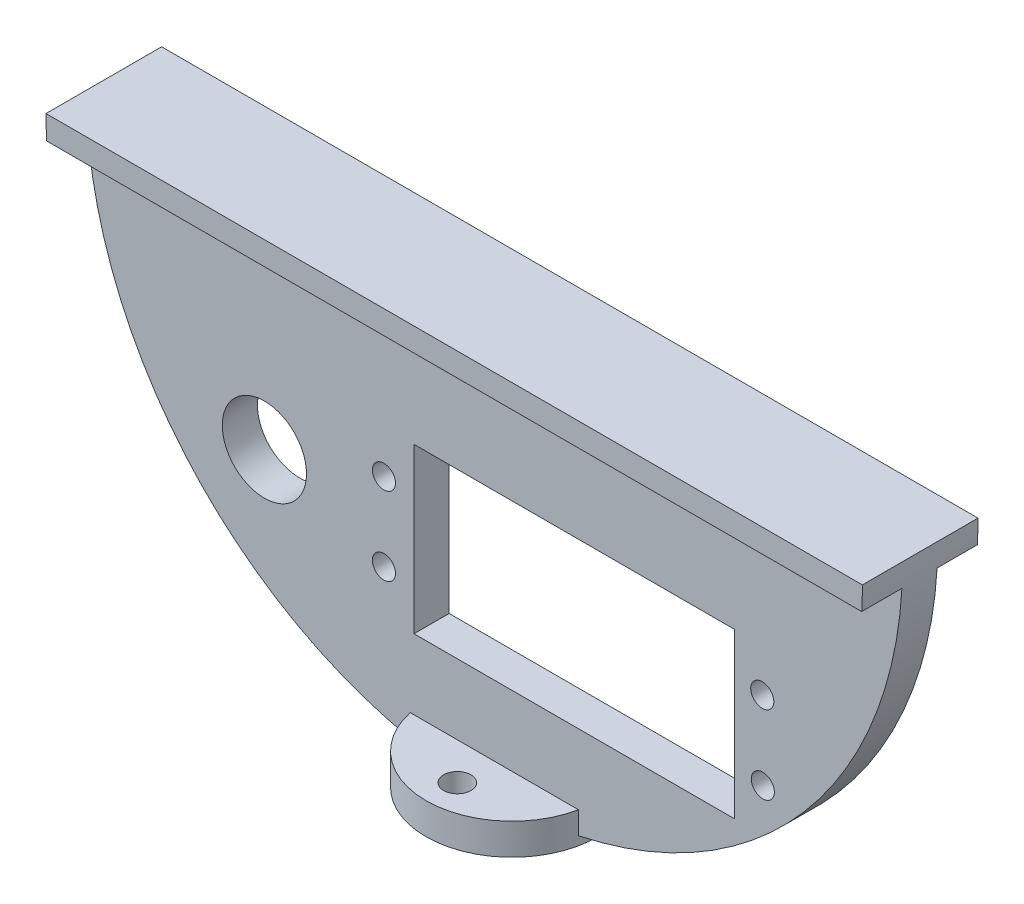
ISO-10303-21;
HEADER;
FILE_DESCRIPTION(('STEP AP214'),'2;1');
FILE_NAME('part.step','',(''),(''),'','','');
FILE_SCHEMA(('AUTOMOTIVE_DESIGN { 1 0 10303 214 1 1 1 1 }'));
ENDSEC;
DATA;
#1=APPLICATION_CONTEXT('core data for automotive mechanical design processes');
#2=APPLICATION_PROTOCOL_DEFINITION('international standard','automotive_design',2000,#1);
#3=PRODUCT_CONTEXT('',#1,'mechanical');
#4=PRODUCT('Part','Part','',(#3));
#5=PRODUCT_RELATED_PRODUCT_CATEGORY('part','',(#4));
#6=PRODUCT_DEFINITION_FORMATION('','',#4);
#7=PRODUCT_DEFINITION_CONTEXT('part definition',#1,'design');
#8=PRODUCT_DEFINITION('design','',#6,#7);
#9=PRODUCT_DEFINITION_SHAPE('','',#8);
#10=(LENGTH_UNIT() NAMED_UNIT(*) SI_UNIT(.MILLI.,.METRE.));
#11=(NAMED_UNIT(*) PLANE_ANGLE_UNIT() SI_UNIT($,.RADIAN.));
#12=(NAMED_UNIT(*) SI_UNIT($,.STERADIAN.) SOLID_ANGLE_UNIT());
#13=UNCERTAINTY_MEASURE_WITH_UNIT(LENGTH_MEASURE(1.E-05),#10,'distance_accuracy_value','');
#14=(GEOMETRIC_REPRESENTATION_CONTEXT(3) GLOBAL_UNCERTAINTY_ASSIGNED_CONTEXT((#13)) GLOBAL_UNIT_ASSIGNED_CONTEXT((#10,
#11,#12)) REPRESENTATION_CONTEXT('',''));
#15=CARTESIAN_POINT('',(0.,0.,0.));
#16=DIRECTION('',(0.,0.,1.));
#17=DIRECTION('',(1.,0.,0.));
#18=AXIS2_PLACEMENT_3D('',#15,#16,#17);
#19=CARTESIAN_POINT('',(0.,0.,4.5));
#20=DIRECTION('',(0.,0.,1.));
#21=DIRECTION('',(1.,0.,0.));
#22=AXIS2_PLACEMENT_3D('',#19,#20,#21);
#23=PLANE('',#22);
#24=CARTESIAN_POINT('',(-29.4453940508057,-28.4254214102192,4.5));
#25=DIRECTION('',(0.,0.,1.));
#26=DIRECTION('',(1.,0.,0.));
#27=AXIS2_PLACEMENT_3D('',#24,#25,#26);
#28=CIRCLE('',#27,5.39005967208397);
#29=CARTESIAN_POINT('',(-24.0553343787218,-28.4254214102192,4.5));
#30=VERTEX_POINT('',#29);
#31=EDGE_CURVE('E500',#30,#30,#28,.T.);
#32=ORIENTED_EDGE('',*,*,#31,.F.);
#33=EDGE_LOOP('',(#32));
#34=FACE_BOUND('',#33,.T.);
#35=CARTESIAN_POINT('',(34.3560560625091,-33.7668022095369,4.5));
#36=DIRECTION('',(0.,0.,1.));
#37=DIRECTION('',(1.,0.,0.));
#38=AXIS2_PLACEMENT_3D('',#35,#36,#37);
#39=CIRCLE('',#38,1.47802183440209);
#40=CARTESIAN_POINT('',(35.8340778969111,-33.7668022095369,4.5));
#41=VERTEX_POINT('',#40);
#42=EDGE_CURVE('E503',#41,#41,#39,.T.);
#43=ORIENTED_EDGE('',*,*,#42,.F.);
#44=EDGE_LOOP('',(#43));
#45=FACE_BOUND('',#44,.T.);
#46=CARTESIAN_POINT('',(-14.1439439374909,-33.7668022095369,4.5));
#47=DIRECTION('',(0.,0.,1.));
#48=DIRECTION('',(1.,0.,0.));
#49=AXIS2_PLACEMENT_3D('',#46,#47,#48);
#50=CIRCLE('',#49,1.47802183440209);
#51=CARTESIAN_POINT('',(-12.6659221030888,-33.7668022095369,4.5));
#52=VERTEX_POINT('',#51);
#53=EDGE_CURVE('E505',#52,#52,#50,.T.);
#54=ORIENTED_EDGE('',*,*,#53,.F.);
#55=EDGE_LOOP('',(#54));
#56=FACE_BOUND('',#55,.T.);
#57=CARTESIAN_POINT('',(34.2860560625091,-23.7668022095369,4.5));
#58=DIRECTION('',(0.,0.,1.));
#59=DIRECTION('',(1.,0.,0.));
#60=AXIS2_PLACEMENT_3D('',#57,#58,#59);
#61=CIRCLE('',#60,1.47802183440209);
#62=CARTESIAN_POINT('',(35.7640778969112,-23.7668022095369,4.5));
#63=VERTEX_POINT('',#62);
#64=EDGE_CURVE('E512',#63,#63,#61,.T.);
#65=ORIENTED_EDGE('',*,*,#64,.F.);
#66=EDGE_LOOP('',(#65));
#67=FACE_BOUND('',#66,.T.);
#68=CARTESIAN_POINT('',(-14.1439439374909,-23.7668022095369,4.5));
#69=DIRECTION('',(0.,0.,1.));
#70=DIRECTION('',(1.,0.,0.));
#71=AXIS2_PLACEMENT_3D('',#68,#69,#70);
#72=CIRCLE('',#71,1.47802183440209);
#73=CARTESIAN_POINT('',(-12.6659221030889,-23.7668022095369,4.5));
#74=VERTEX_POINT('',#73);
#75=EDGE_CURVE('E509',#74,#74,#72,.T.);
#76=ORIENTED_EDGE('',*,*,#75,.F.);
#77=EDGE_LOOP('',(#76));
#78=FACE_BOUND('',#77,.T.);
#79=DIRECTION('',(0.,-1.,0.));
#80=VECTOR('',#79,1.);
#81=CARTESIAN_POINT('',(-10.2939439374909,-18.2668022095369,4.5));
#82=LINE('',#81,#80);
#83=CARTESIAN_POINT('',(-10.2939439374909,-18.2668022095369,4.5));
#84=VERTEX_POINT('',#83);
#85=CARTESIAN_POINT('',(-10.2939439374909,-39.2668022095369,4.5));
#86=VERTEX_POINT('',#85);
#87=EDGE_CURVE('E61',#84,#86,#82,.T.);
#88=ORIENTED_EDGE('',*,*,#87,.F.);
#89=DIRECTION('',(-1.,0.,0.));
#90=VECTOR('',#89,1.);
#91=CARTESIAN_POINT('',(-10.2939439374909,-18.2668022095369,4.5));
#92=LINE('',#91,#90);
#93=CARTESIAN_POINT('',(30.7060560625091,-18.2668022095369,4.5));
#94=VERTEX_POINT('',#93);
#95=EDGE_CURVE('E165',#94,#84,#92,.T.);
#96=ORIENTED_EDGE('',*,*,#95,.F.);
#97=DIRECTION('',(0.,1.,0.));
#98=VECTOR('',#97,1.);
#99=CARTESIAN_POINT('',(30.7060560625091,-18.2668022095369,4.5));
#100=LINE('',#99,#98);
#101=CARTESIAN_POINT('',(30.7060560625091,-39.2668022095369,4.5));
#102=VERTEX_POINT('',#101);
#103=EDGE_CURVE('E150',#102,#94,#100,.T.);
#104=ORIENTED_EDGE('',*,*,#103,.F.);
#105=DIRECTION('',(1.,0.,0.));
#106=VECTOR('',#105,1.);
#107=CARTESIAN_POINT('',(-10.2939439374909,-39.2668022095369,4.5));
#108=LINE('',#107,#106);
#109=EDGE_CURVE('E159',#86,#102,#108,.T.);
#110=ORIENTED_EDGE('',*,*,#109,.F.);
#111=EDGE_LOOP('',(#88,#96,#104,#110));
#112=FACE_BOUND('',#111,.T.);
#113=CARTESIAN_POINT('',(0.,0.,4.5));
#114=DIRECTION('',(0.,0.,1.));
#115=DIRECTION('',(1.,0.,0.));
#116=AXIS2_PLACEMENT_3D('',#113,#114,#115);
#117=CIRCLE('',#116,52.25);
#118=CARTESIAN_POINT('',(-52.1638045008222,-3.,4.5));
#119=VERTEX_POINT('',#118);
#120=CARTESIAN_POINT('',(-10.767427733679,-51.1285145491241,4.5));
#121=VERTEX_POINT('',#120);
#122=EDGE_CURVE('E242',#119,#121,#117,.T.);
#123=ORIENTED_EDGE('',*,*,#122,.T.);
#124=DIRECTION('',(0.,-1.,0.));
#125=VECTOR('',#124,1.);
#126=CARTESIAN_POINT('',(-10.767427733679,-48.25,4.5));
#127=LINE('',#126,#125);
#128=CARTESIAN_POINT('',(-10.767427733679,-48.25,4.5));
#129=VERTEX_POINT('',#128);
#130=EDGE_CURVE('E198',#121,#129,#127,.F.);
#131=ORIENTED_EDGE('',*,*,#130,.T.);
#132=DIRECTION('',(-1.,0.,0.));
#133=VECTOR('',#132,1.);
#134=CARTESIAN_POINT('',(0.,-48.25,4.5));
#135=LINE('',#134,#133);
#136=CARTESIAN_POINT('',(10.767427733679,-48.25,4.5));
#137=VERTEX_POINT('',#136);
#138=EDGE_CURVE('E205',#137,#129,#135,.T.);
#139=ORIENTED_EDGE('',*,*,#138,.F.);
#140=DIRECTION('',(0.,-1.,0.));
#141=VECTOR('',#140,1.);
#142=CARTESIAN_POINT('',(10.767427733679,-48.25,4.5));
#143=LINE('',#142,#141);
#144=CARTESIAN_POINT('',(10.767427733679,-51.1285145491241,4.5));
#145=VERTEX_POINT('',#144);
#146=EDGE_CURVE('E203',#137,#145,#143,.T.);
#147=ORIENTED_EDGE('',*,*,#146,.T.);
#148=CARTESIAN_POINT('',(52.1638045008222,-3.,4.5));
#149=VERTEX_POINT('',#148);
#150=EDGE_CURVE('E246',#145,#149,#117,.T.);
#151=ORIENTED_EDGE('',*,*,#150,.T.);
#152=DIRECTION('',(-1.,0.,0.));
#153=VECTOR('',#152,1.);
#154=CARTESIAN_POINT('',(0.,-3.,4.5));
#155=LINE('',#154,#153);
#156=EDGE_CURVE('E239',#149,#119,#155,.T.);
#157=ORIENTED_EDGE('',*,*,#156,.T.);
#158=EDGE_LOOP('',(#123,#131,#139,#147,#151,#157));
#159=FACE_BOUND('',#158,.T.);
#160=ADVANCED_FACE('F43',(#34,#45,#56,#67,#78,#112,#159),#23,.T.);
#161=CARTESIAN_POINT('',(0.,0.,0.));
#162=DIRECTION('',(0.,0.,1.));
#163=DIRECTION('',(1.,0.,0.));
#164=AXIS2_PLACEMENT_3D('',#161,#162,#163);
#165=PLANE('',#164);
#166=CARTESIAN_POINT('',(-29.4453940508057,-28.4254214102192,0.));
#167=DIRECTION('',(0.,0.,1.));
#168=DIRECTION('',(1.,0.,0.));
#169=AXIS2_PLACEMENT_3D('',#166,#167,#168);
#170=CIRCLE('',#169,5.39005967208397);
#171=CARTESIAN_POINT('',(-24.0553343787218,-28.4254214102192,0.));
#172=VERTEX_POINT('',#171);
#173=EDGE_CURVE('E48',#172,#172,#170,.T.);
#174=ORIENTED_EDGE('',*,*,#173,.T.);
#175=EDGE_LOOP('',(#174));
#176=FACE_BOUND('',#175,.T.);
#177=CARTESIAN_POINT('',(34.3560560625091,-33.7668022095369,0.));
#178=DIRECTION('',(0.,0.,1.));
#179=DIRECTION('',(1.,0.,0.));
#180=AXIS2_PLACEMENT_3D('',#177,#178,#179);
#181=CIRCLE('',#180,1.47802183440209);
#182=CARTESIAN_POINT('',(35.8340778969111,-33.7668022095369,0.));
#183=VERTEX_POINT('',#182);
#184=EDGE_CURVE('E188',#183,#183,#181,.T.);
#185=ORIENTED_EDGE('',*,*,#184,.T.);
#186=EDGE_LOOP('',(#185));
#187=FACE_BOUND('',#186,.T.);
#188=CARTESIAN_POINT('',(-14.1439439374909,-33.7668022095369,0.));
#189=DIRECTION('',(0.,0.,1.));
#190=DIRECTION('',(1.,0.,0.));
#191=AXIS2_PLACEMENT_3D('',#188,#189,#190);
#192=CIRCLE('',#191,1.47802183440209);
#193=CARTESIAN_POINT('',(-12.6659221030888,-33.7668022095369,0.));
#194=VERTEX_POINT('',#193);
#195=EDGE_CURVE('E530',#194,#194,#192,.T.);
#196=ORIENTED_EDGE('',*,*,#195,.T.);
#197=EDGE_LOOP('',(#196));
#198=FACE_BOUND('',#197,.T.);
#199=CARTESIAN_POINT('',(34.2860560625091,-23.7668022095369,0.));
#200=DIRECTION('',(0.,0.,1.));
#201=DIRECTION('',(1.,0.,0.));
#202=AXIS2_PLACEMENT_3D('',#199,#200,#201);
#203=CIRCLE('',#202,1.47802183440209);
#204=CARTESIAN_POINT('',(35.7640778969112,-23.7668022095369,0.));
#205=VERTEX_POINT('',#204);
#206=EDGE_CURVE('E527',#205,#205,#203,.T.);
#207=ORIENTED_EDGE('',*,*,#206,.T.);
#208=EDGE_LOOP('',(#207));
#209=FACE_BOUND('',#208,.T.);
#210=CARTESIAN_POINT('',(-14.1439439374909,-23.7668022095369,0.));
#211=DIRECTION('',(0.,0.,1.));
#212=DIRECTION('',(1.,0.,0.));
#213=AXIS2_PLACEMENT_3D('',#210,#211,#212);
#214=CIRCLE('',#213,1.47802183440209);
#215=CARTESIAN_POINT('',(-12.6659221030889,-23.7668022095369,0.));
#216=VERTEX_POINT('',#215);
#217=EDGE_CURVE('E172',#216,#216,#214,.T.);
#218=ORIENTED_EDGE('',*,*,#217,.T.);
#219=EDGE_LOOP('',(#218));
#220=FACE_BOUND('',#219,.T.);
#221=DIRECTION('',(-1.,0.,0.));
#222=VECTOR('',#221,1.);
#223=CARTESIAN_POINT('',(0.,-18.2668022095369,0.));
#224=LINE('',#223,#222);
#225=CARTESIAN_POINT('',(30.7060560625091,-18.2668022095369,0.));
#226=VERTEX_POINT('',#225);
#227=CARTESIAN_POINT('',(-10.2939439374909,-18.2668022095369,0.));
#228=VERTEX_POINT('',#227);
#229=EDGE_CURVE('E53',#226,#228,#224,.T.);
#230=ORIENTED_EDGE('',*,*,#229,.T.);
#231=DIRECTION('',(0.,-1.,0.));
#232=VECTOR('',#231,1.);
#233=CARTESIAN_POINT('',(-10.2939439374909,0.,0.));
#234=LINE('',#233,#232);
#235=CARTESIAN_POINT('',(-10.2939439374909,-39.2668022095369,0.));
#236=VERTEX_POINT('',#235);
#237=EDGE_CURVE('E11',#228,#236,#234,.T.);
#238=ORIENTED_EDGE('',*,*,#237,.T.);
#239=DIRECTION('',(1.,0.,0.));
#240=VECTOR('',#239,1.);
#241=CARTESIAN_POINT('',(0.,-39.2668022095369,0.));
#242=LINE('',#241,#240);
#243=CARTESIAN_POINT('',(30.7060560625091,-39.2668022095369,0.));
#244=VERTEX_POINT('',#243);
#245=EDGE_CURVE('E342',#236,#244,#242,.T.);
#246=ORIENTED_EDGE('',*,*,#245,.T.);
#247=DIRECTION('',(0.,1.,0.));
#248=VECTOR('',#247,1.);
#249=CARTESIAN_POINT('',(30.7060560625091,0.,0.));
#250=LINE('',#249,#248);
#251=EDGE_CURVE('E153',#244,#226,#250,.T.);
#252=ORIENTED_EDGE('',*,*,#251,.T.);
#253=EDGE_LOOP('',(#230,#238,#246,#252));
#254=FACE_BOUND('',#253,.T.);
#255=DIRECTION('',(0.,-1.,0.));
#256=VECTOR('',#255,1.);
#257=CARTESIAN_POINT('',(-10.767427733679,-48.25,0.));
#258=LINE('',#257,#256);
#259=CARTESIAN_POINT('',(-10.767427733679,-51.1285145491241,0.));
#260=VERTEX_POINT('',#259);
#261=CARTESIAN_POINT('',(-10.767427733679,-48.25,0.));
#262=VERTEX_POINT('',#261);
#263=EDGE_CURVE('E195',#260,#262,#258,.F.);
#264=ORIENTED_EDGE('',*,*,#263,.F.);
#265=CARTESIAN_POINT('',(0.,0.,0.));
#266=DIRECTION('',(0.,0.,1.));
#267=DIRECTION('',(1.,0.,0.));
#268=AXIS2_PLACEMENT_3D('',#265,#266,#267);
#269=CIRCLE('',#268,52.25);
#270=CARTESIAN_POINT('',(-52.1638045008222,-3.,0.));
#271=VERTEX_POINT('',#270);
#272=EDGE_CURVE('E247',#271,#260,#269,.T.);
#273=ORIENTED_EDGE('',*,*,#272,.F.);
#274=DIRECTION('',(-1.,0.,0.));
#275=VECTOR('',#274,1.);
#276=CARTESIAN_POINT('',(0.,-3.,0.));
#277=LINE('',#276,#275);
#278=CARTESIAN_POINT('',(52.1638045008222,-3.,0.));
#279=VERTEX_POINT('',#278);
#280=EDGE_CURVE('E252',#279,#271,#277,.T.);
#281=ORIENTED_EDGE('',*,*,#280,.F.);
#282=CARTESIAN_POINT('',(10.767427733679,-51.1285145491241,0.));
#283=VERTEX_POINT('',#282);
#284=EDGE_CURVE('E241',#283,#279,#269,.T.);
#285=ORIENTED_EDGE('',*,*,#284,.F.);
#286=DIRECTION('',(0.,-1.,0.));
#287=VECTOR('',#286,1.);
#288=CARTESIAN_POINT('',(10.767427733679,-48.25,0.));
#289=LINE('',#288,#287);
#290=CARTESIAN_POINT('',(10.767427733679,-48.25,0.));
#291=VERTEX_POINT('',#290);
#292=EDGE_CURVE('E200',#291,#283,#289,.T.);
#293=ORIENTED_EDGE('',*,*,#292,.F.);
#294=DIRECTION('',(-1.,0.,0.));
#295=VECTOR('',#294,1.);
#296=CARTESIAN_POINT('',(0.,-48.25,0.));
#297=LINE('',#296,#295);
#298=EDGE_CURVE('E262',#291,#262,#297,.T.);
#299=ORIENTED_EDGE('',*,*,#298,.T.);
#300=EDGE_LOOP('',(#264,#273,#281,#285,#293,#299));
#301=FACE_BOUND('',#300,.T.);
#302=ADVANCED_FACE('F290',(#176,#187,#198,#209,#220,#254,#301),#165,.F.);
#303=CARTESIAN_POINT('',(0.,0.,4.5));
#304=DIRECTION('',(0.,0.,-1.));
#305=DIRECTION('',(-1.,0.,0.));
#306=AXIS2_PLACEMENT_3D('',#303,#304,#305);
#307=CYLINDRICAL_SURFACE('',#306,52.25);
#308=CARTESIAN_POINT('',(0.,-52.25,-8.75));
#309=CARTESIAN_POINT('',(0.30542774422126,-52.2500035044439,-8.75000661611907));
#310=CARTESIAN_POINT('',(0.610774800715626,-52.2473174153071,-8.73727613574851));
#311=CARTESIAN_POINT('',(1.21935049360583,-52.236655716327,-8.68646992622895));
#312=CARTESIAN_POINT('',(1.52257878683869,-52.228679268825,-8.64839018335382));
#313=CARTESIAN_POINT('',(2.12482973612014,-52.2076477981882,-8.54714878524386));
#314=CARTESIAN_POINT('',(2.42384952525128,-52.194589471687,-8.48397081488845));
#315=CARTESIAN_POINT('',(3.01537799316569,-52.1637585604862,-8.33303657364289));
#316=CARTESIAN_POINT('',(3.30788654057395,-52.14598588076,-8.24527980731944));
#317=CARTESIAN_POINT('',(3.88404113997619,-52.1062379626673,-8.04597259192359));
#318=CARTESIAN_POINT('',(4.16769607942561,-52.0842671074245,-7.93444694496716));
#319=CARTESIAN_POINT('',(4.72452773325203,-52.0367123139476,-7.68838475599573));
#320=CARTESIAN_POINT('',(4.99770436003278,-52.0111283455172,-7.55384802166465));
#321=CARTESIAN_POINT('',(5.53168740562185,-51.9570490409236,-7.26277458814556));
#322=CARTESIAN_POINT('',(5.79249661887698,-51.9285543670753,-7.10624289075782));
#323=CARTESIAN_POINT('',(6.30017769580982,-51.8694091386543,-6.77220176406812));
#324=CARTESIAN_POINT('',(6.54704493101329,-51.838757875631,-6.59468542805613));
#325=CARTESIAN_POINT('',(7.02830414528038,-51.7757194326662,-6.21744654761459));
#326=CARTESIAN_POINT('',(7.26248806738109,-51.7433146612874,-6.0174614710465));
#327=CARTESIAN_POINT('',(7.71323962127681,-51.6780447390069,-5.59860443211979));
#328=CARTESIAN_POINT('',(7.9298071120398,-51.6451795844221,-5.37973231858594));
#329=CARTESIAN_POINT('',(8.34392388732784,-51.5798933365753,-4.9245129970634));
#330=CARTESIAN_POINT('',(8.54146824600731,-51.5474723601829,-4.68816129077395));
#331=CARTESIAN_POINT('',(8.9160592544566,-51.4840021200619,-4.19969640125073));
#332=CARTESIAN_POINT('',(9.09311304732179,-51.4529523806629,-3.94758875808643));
#333=CARTESIAN_POINT('',(9.42728954258514,-51.3927801086111,-3.42653007410464));
#334=CARTESIAN_POINT('',(9.58418643026197,-51.3636809098344,-3.1574314340929));
#335=CARTESIAN_POINT('',(9.87471405207177,-51.308619113203,-2.60664144262729));
#336=CARTESIAN_POINT('',(10.0083445833153,-51.2826565427013,-2.32494998138723));
#337=CARTESIAN_POINT('',(10.2513062561535,-51.2346422310222,-1.75097841522664));
#338=CARTESIAN_POINT('',(10.3606394782575,-51.212590155033,-1.45869921939809));
#339=CARTESIAN_POINT('',(10.5541532056355,-51.1730604362124,-0.865628365787486));
#340=CARTESIAN_POINT('',(10.6383341287184,-51.1555827173961,-0.564836849495844));
#341=CARTESIAN_POINT('',(10.7798253311149,-51.1259524995149,0.0386588092648649));
#342=CARTESIAN_POINT('',(10.8375065742371,-51.1137266490955,0.341272395308378));
#343=CARTESIAN_POINT('',(10.9273014982731,-51.0946053477136,0.95043684996661));
#344=CARTESIAN_POINT('',(10.9594154018146,-51.0877098503368,1.25698768427409));
#345=CARTESIAN_POINT('',(10.9978073479132,-51.0794588934356,1.87174679817147));
#346=CARTESIAN_POINT('',(11.0040879630539,-51.0781028822667,2.17995490966202));
#347=CARTESIAN_POINT('',(10.9907676373281,-51.0809707584193,2.79578358824054));
#348=CARTESIAN_POINT('',(10.9711669396057,-51.0851945933205,3.10340416082099));
#349=CARTESIAN_POINT('',(10.906795641267,-51.0989761667235,3.71063559855589));
#350=CARTESIAN_POINT('',(10.8624541445181,-51.1084429514161,4.01029413911348));
#351=CARTESIAN_POINT('',(10.7492672424755,-51.1323683652679,4.60473911603598));
#352=CARTESIAN_POINT('',(10.6804221537197,-51.146826929943,4.89952561528657));
#353=CARTESIAN_POINT('',(10.5187615976709,-51.1803180916697,5.48219252442763));
#354=CARTESIAN_POINT('',(10.4259452665986,-51.199350853546,5.77007268504664));
#355=CARTESIAN_POINT('',(10.2170456282063,-51.2414463266731,6.33695872786808));
#356=CARTESIAN_POINT('',(10.1009620553881,-51.264509083909,6.61596450876455));
#357=CARTESIAN_POINT('',(9.84543400343754,-51.3141986728167,7.16526866771179));
#358=CARTESIAN_POINT('',(9.7058227319102,-51.3408506571807,7.43548716742986));
#359=CARTESIAN_POINT('',(9.40485214789984,-51.3968352503747,7.96323319957722));
#360=CARTESIAN_POINT('',(9.24349277277819,-51.4261678669253,8.22076069545113));
#361=CARTESIAN_POINT('',(8.90012905927569,-51.4867029850409,8.72146526361976));
#362=CARTESIAN_POINT('',(8.71812274654941,-51.5179056652943,8.96464096015035));
#363=CARTESIAN_POINT('',(8.33469963885511,-51.5813244419232,9.43504424103798));
#364=CARTESIAN_POINT('',(8.13328216264737,-51.6135405738393,9.66227126518827));
#365=CARTESIAN_POINT('',(7.70815638280629,-51.6787575048409,10.1036666844729));
#366=CARTESIAN_POINT('',(7.4840828716688,-51.7117611123056,10.3174830816465));
#367=CARTESIAN_POINT('',(7.01864237864466,-51.7769868766148,10.7255202827361));
#368=CARTESIAN_POINT('',(6.77727515699704,-51.8092090226167,10.9197408148838));
#369=CARTESIAN_POINT('',(6.27886839992299,-51.871971118821,11.2872384707379));
#370=CARTESIAN_POINT('',(6.02182828733027,-51.9025110069938,11.460514822457));
#371=CARTESIAN_POINT('',(5.49383823963621,-51.9610505747576,11.7848692610955));
#372=CARTESIAN_POINT('',(5.22288877241559,-51.9890503397052,11.9359480940322));
#373=CARTESIAN_POINT('',(4.6684092705646,-52.0417730890081,12.2150626525783));
#374=CARTESIAN_POINT('',(4.38485631352987,-52.0664897471469,12.3430540560951));
#375=CARTESIAN_POINT('',(3.80764455311428,-52.1118809904983,12.5746571170513));
#376=CARTESIAN_POINT('',(3.51398571372867,-52.1325555613081,12.6782686876212));
#377=CARTESIAN_POINT('',(2.918705242908,-52.1692684262469,12.8602789585233));
#378=CARTESIAN_POINT('',(2.61708448798209,-52.1853072284132,12.9386804217563));
#379=CARTESIAN_POINT('',(2.00806126279999,-52.2122886576251,13.0696441709258));
#380=CARTESIAN_POINT('',(1.70065889178173,-52.223231372059,13.1222068999492));
#381=CARTESIAN_POINT('',(1.0880731287604,-52.2395515038219,13.2003274793452));
#382=CARTESIAN_POINT('',(0.782953618078995,-52.2450279782447,13.2263661739831));
#383=CARTESIAN_POINT('',(0.171558460256514,-52.2506126327035,13.2529174060698));
#384=CARTESIAN_POINT('',(-0.134717172628346,-52.2507208787207,13.2534302572577));
#385=CARTESIAN_POINT('',(-0.746180929536525,-52.2455662253439,13.2289267258729));
#386=CARTESIAN_POINT('',(-1.05136911604556,-52.2403036397255,13.2039118346855));
#387=CARTESIAN_POINT('',(-1.6584653096944,-52.2245555110201,13.1285593352274));
#388=CARTESIAN_POINT('',(-1.96037332437138,-52.2140699799369,13.0782217851558));
#389=CARTESIAN_POINT('',(-2.55571930805514,-52.1883002817393,12.9532648517305));
#390=CARTESIAN_POINT('',(-2.84921201967738,-52.1730656352523,12.8788957729502));
#391=CARTESIAN_POINT('',(-3.42882776000708,-52.1381812009577,12.7063174468561));
#392=CARTESIAN_POINT('',(-3.71495085412908,-52.1185314523548,12.6081084112323));
#393=CARTESIAN_POINT('',(-4.27789938009257,-52.0753471835529,12.388582666466));
#394=CARTESIAN_POINT('',(-4.55472437388898,-52.051812480637,12.2672648704322));
#395=CARTESIAN_POINT('',(-5.09722992227253,-52.001490101594,12.002403267025));
#396=CARTESIAN_POINT('',(-5.36291002615748,-51.9747022940807,11.858858561889));
#397=CARTESIAN_POINT('',(-5.88484469005448,-51.9182138560963,11.5484952999468));
#398=CARTESIAN_POINT('',(-6.140925912903,-51.8884790928838,11.3813914365867));
#399=CARTESIAN_POINT('',(-6.63815550277959,-51.8272144070494,11.0265698703684));
#400=CARTESIAN_POINT('',(-6.87930375733147,-51.7956844709095,10.8388520122739));
#401=CARTESIAN_POINT('',(-7.34510996018878,-51.7316841544259,10.4440575803501));
#402=CARTESIAN_POINT('',(-7.56976597768615,-51.6992136645866,10.2369787462906));
#403=CARTESIAN_POINT('',(-8.00107375938886,-51.6342221144019,9.80486637847805));
#404=CARTESIAN_POINT('',(-8.20772578052985,-51.6017010547851,9.57983310104129));
#405=CARTESIAN_POINT('',(-8.60501076089678,-51.5369527173713,9.10931475492592));
#406=CARTESIAN_POINT('',(-8.7953111566348,-51.5047398638583,8.86354675341181));
#407=CARTESIAN_POINT('',(-9.15453539138605,-51.4421056871545,8.35663441285027));
#408=CARTESIAN_POINT('',(-9.32345895711101,-51.4116843868701,8.09548987728681));
#409=CARTESIAN_POINT('',(-9.63870244777168,-51.3535161197911,7.55961813904119));
#410=CARTESIAN_POINT('',(-9.78502296188356,-51.3257690832956,7.2848912906451));
#411=CARTESIAN_POINT('',(-10.0539695587961,-51.2737649106075,6.72375612970254));
#412=CARTESIAN_POINT('',(-10.1765958960511,-51.2495077369376,6.43734794264328));
#413=CARTESIAN_POINT('',(-10.3965963064884,-51.2053299373665,5.85648074150399));
#414=CARTESIAN_POINT('',(-10.4941059230356,-51.185386132028,5.56207484211089));
#415=CARTESIAN_POINT('',(-10.6639789663353,-51.1502647615728,4.96581399347586));
#416=CARTESIAN_POINT('',(-10.7363424394269,-51.1350871876731,4.66395905796202));
#417=CARTESIAN_POINT('',(-10.8553238659169,-51.1099613289033,4.05503918335708));
#418=CARTESIAN_POINT('',(-10.9019449878736,-51.1000124004602,3.74797489026993));
#419=CARTESIAN_POINT('',(-10.9690646270815,-51.0856467618078,3.13087744282423));
#420=CARTESIAN_POINT('',(-10.9895635615423,-51.0812299632423,2.82084433596166));
#421=CARTESIAN_POINT('',(-11.0041186292738,-51.078096306685,2.20639638083131));
#422=CARTESIAN_POINT('',(-10.9987000868022,-51.0792662104069,1.9019944268027));
#423=CARTESIAN_POINT('',(-10.962664781535,-51.0870122435083,1.29475842862829));
#424=CARTESIAN_POINT('',(-10.932048377934,-51.0935882958234,0.991924362194234));
#425=CARTESIAN_POINT('',(-10.845866433865,-51.1119518008377,0.389995066366881));
#426=CARTESIAN_POINT('',(-10.7903012909264,-51.1237391705006,0.0908997774785291));
#427=CARTESIAN_POINT('',(-10.6546644476655,-51.1521790335111,-0.501443990764038));
#428=CARTESIAN_POINT('',(-10.5745926401487,-51.1688315481393,-0.794692444537634));
#429=CARTESIAN_POINT('',(-10.3908414075336,-51.206461249153,-1.37243407358907));
#430=CARTESIAN_POINT('',(-10.287233581045,-51.2274253015278,-1.65695089147018));
#431=CARTESIAN_POINT('',(-10.0570531679615,-51.2731112662195,-2.21622035210235));
#432=CARTESIAN_POINT('',(-9.93048067747221,-51.29783316281,-2.49097303570994));
#433=CARTESIAN_POINT('',(-9.65530094547716,-51.350338560903,-3.02886519746426));
#434=CARTESIAN_POINT('',(-9.50669613592566,-51.3781217244122,-3.29200595319512));
#435=CARTESIAN_POINT('',(-9.18841978843759,-51.4359952079237,-3.8050902605092));
#436=CARTESIAN_POINT('',(-9.01874026422527,-51.4660864008928,-4.05502875763722));
#437=CARTESIAN_POINT('',(-8.65620364009981,-51.5283132951291,-4.54445171407985));
#438=CARTESIAN_POINT('',(-8.46297803452258,-51.5604763991519,-4.7836597972175));
#439=CARTESIAN_POINT('',(-8.05714406416598,-51.6254507704221,-5.2451242491547));
#440=CARTESIAN_POINT('',(-7.84452688848178,-51.6582623269483,-5.46737282701746));
#441=CARTESIAN_POINT('',(-7.40136128848284,-51.723616615635,-5.8933615096945));
#442=CARTESIAN_POINT('',(-7.17080876416751,-51.7561592844361,-6.09709735930589));
#443=CARTESIAN_POINT('',(-6.69346058877045,-51.8200543716527,-6.48453123187444));
#444=CARTESIAN_POINT('',(-6.44667228721434,-51.8514073186275,-6.66823822266965));
#445=CARTESIAN_POINT('',(-5.93527851514947,-51.9124462323001,-7.01657160398456));
#446=CARTESIAN_POINT('',(-5.6704914899683,-51.9421070056633,-7.18093603194224));
#447=CARTESIAN_POINT('',(-5.12779204780584,-51.9984869538259,-7.48666873877052));
#448=CARTESIAN_POINT('',(-4.8498845818632,-52.0252072257528,-7.62804560397382));
#449=CARTESIAN_POINT('',(-4.28294425190179,-52.0749437711294,-7.8867348732868));
#450=CARTESIAN_POINT('',(-3.99391783957973,-52.0979621535742,-8.00406098983358));
#451=CARTESIAN_POINT('',(-3.40676099342191,-52.1396507928959,-8.21380455642121));
#452=CARTESIAN_POINT('',(-3.10863225322209,-52.1583218531528,-8.30622660920022));
#453=CARTESIAN_POINT('',(-2.35003165323887,-52.1991253588719,-8.50641272407588));
#454=CARTESIAN_POINT('',(-1.8849121253758,-52.2181006147286,-8.59762720646657));
#455=CARTESIAN_POINT('',(-0.946463646128785,-52.2435349806031,-8.71941455548049));
#456=CARTESIAN_POINT('',(-0.473135010731013,-52.2499945713016,-8.74998975103727));
#457=CARTESIAN_POINT('',(0.,-52.25,-8.75));
#458=B_SPLINE_CURVE_WITH_KNOTS('',3,(#308,#309,#310,#311,#312,#313,#314,#315,#316,#317,#318,
#319,#320,#321,#322,#323,#324,#325,#326,#327,#328,#329,#330,#331,#332,#333,#334,#335,#336,#337,
#338,#339,#340,#341,#342,#343,#344,#345,#346,#347,#348,#349,#350,#351,#352,#353,#354,#355,#356,
#357,#358,#359,#360,#361,#362,#363,#364,#365,#366,#367,#368,#369,#370,#371,#372,#373,#374,#375,
#376,#377,#378,#379,#380,#381,#382,#383,#384,#385,#386,#387,#388,#389,#390,#391,#392,#393,#394,
#395,#396,#397,#398,#399,#400,#401,#402,#403,#404,#405,#406,#407,#408,#409,#410,#411,#412,#413,
#414,#415,#416,#417,#418,#419,#420,#421,#422,#423,#424,#425,#426,#427,#428,#429,#430,#431,#432,
#433,#434,#435,#436,#437,#438,#439,#440,#441,#442,#443,#444,#445,#446,#447,#448,#449,#450,#451,
#452,#453,#454,#455,#456,#457),.UNSPECIFIED.,.T.,.F.,(4,2,2,2,2,2,2,2,2,2,2,2,2,2,2,2,2,2,2,2,2,
2,2,2,2,2,2,2,2,2,2,2,2,2,2,2,2,2,2,2,2,2,2,2,2,2,2,2,2,2,2,2,2,2,2,2,2,2,2,2,2,2,2,2,2,2,2,2,2,
2,2,2,2,2,4),(0.,0.915867498507801,1.83188004722926,2.74848902747883,3.66511648508966,
4.58079211178143,5.49647539164203,6.41195077505002,7.3277283137865,8.25561192483753,
9.18350296352425,10.1116336276594,11.0394397607763,11.9768707613942,12.9143099362765,
13.8516688099587,14.789012112155,15.7128008232243,16.636581490309,17.5602701613376,
18.4839501547624,19.3920866692063,20.3002114527472,21.2083689642019,22.1165368390607,
23.0314368401208,23.9463394763219,24.8613296731554,25.7763519935051,26.7096720569968,
27.643005062596,28.5763724596856,29.5097084808544,30.4448176347325,31.3799301205163,
32.3149400877215,33.249934020667,34.1676587852892,35.0853722701183,36.0030321432322,
36.9206899073016,37.829082116506,38.7374662598196,39.6458931383865,40.5543567186198,
41.4749568644001,42.3955639433627,43.3162786299326,44.2369801747989,45.1733542969748,
46.1097403888499,47.046102068557,47.9824536920118,48.9136410684329,49.8448267288628,
50.7758977465378,51.7069538934584,52.6192192787901,53.5314716600355,54.4437095061088,
55.3559513424588,56.2654543662155,57.1749535838481,58.0843524844856,58.9940970598891,
59.9205532739904,60.8474325572659,61.7745243502803,62.7011993221537,63.6392519014895,
64.5769532897561,65.514118555206,66.4511104959505,67.8699260111704,69.2886870338127),.UNSPECIFIED.);
#459=EDGE_CURVE('E261',#283,#145,#458,.T.);
#460=ORIENTED_EDGE('',*,*,#459,.F.);
#461=ORIENTED_EDGE('',*,*,#284,.T.);
#462=DIRECTION('',(0.,0.,-1.));
#463=VECTOR('',#462,1.);
#464=CARTESIAN_POINT('',(52.1638045008222,-3.,9.65));
#465=LINE('',#464,#463);
#466=CARTESIAN_POINT('',(52.1638045008222,-3.,-5.15));
#467=VERTEX_POINT('',#466);
#468=EDGE_CURVE('E221',#279,#467,#465,.T.);
#469=ORIENTED_EDGE('',*,*,#468,.T.);
#470=CARTESIAN_POINT('',(0.,0.,-5.15));
#471=DIRECTION('',(0.,0.,1.));
#472=DIRECTION('',(1.,0.,0.));
#473=AXIS2_PLACEMENT_3D('',#470,#471,#472);
#474=CIRCLE('',#473,52.25);
#475=CARTESIAN_POINT('',(52.25,0.,-5.15));
#476=VERTEX_POINT('',#475);
#477=EDGE_CURVE('E227',#467,#476,#474,.T.);
#478=ORIENTED_EDGE('',*,*,#477,.T.);
#479=DIRECTION('',(0.,0.,-1.));
#480=VECTOR('',#479,1.);
#481=CARTESIAN_POINT('',(52.25,0.,4.5));
#482=LINE('',#481,#480);
#483=CARTESIAN_POINT('',(52.25,0.,9.65));
#484=VERTEX_POINT('',#483);
#485=EDGE_CURVE('E250',#484,#476,#482,.T.);
#486=ORIENTED_EDGE('',*,*,#485,.F.);
#487=CARTESIAN_POINT('',(0.,0.,9.65));
#488=DIRECTION('',(0.,0.,1.));
#489=DIRECTION('',(1.,0.,0.));
#490=AXIS2_PLACEMENT_3D('',#487,#488,#489);
#491=CIRCLE('',#490,52.25);
#492=CARTESIAN_POINT('',(52.1638045008222,-3.,9.65));
#493=VERTEX_POINT('',#492);
#494=EDGE_CURVE('E215',#493,#484,#491,.T.);
#495=ORIENTED_EDGE('',*,*,#494,.F.);
#496=EDGE_CURVE('E232',#493,#149,#465,.T.);
#497=ORIENTED_EDGE('',*,*,#496,.T.);
#498=ORIENTED_EDGE('',*,*,#150,.F.);
#499=EDGE_LOOP('',(#460,#461,#469,#478,#486,#495,#497,#498));
#500=FACE_BOUND('',#499,.T.);
#501=ADVANCED_FACE('F45',(#500),#307,.T.);
#502=EDGE_CURVE('E254',#121,#260,#458,.T.);
#503=ORIENTED_EDGE('',*,*,#502,.F.);
#504=ORIENTED_EDGE('',*,*,#122,.F.);
#505=DIRECTION('',(0.,0.,-1.));
#506=VECTOR('',#505,1.);
#507=CARTESIAN_POINT('',(-52.1638045008222,-3.,9.65));
#508=LINE('',#507,#506);
#509=CARTESIAN_POINT('',(-52.1638045008222,-3.,9.65));
#510=VERTEX_POINT('',#509);
#511=EDGE_CURVE('E236',#510,#119,#508,.T.);
#512=ORIENTED_EDGE('',*,*,#511,.F.);
#513=CARTESIAN_POINT('',(0.,0.,9.65));
#514=DIRECTION('',(0.,0.,1.));
#515=DIRECTION('',(1.,0.,0.));
#516=AXIS2_PLACEMENT_3D('',#513,#514,#515);
#517=CIRCLE('',#516,52.25);
#518=CARTESIAN_POINT('',(-52.25,0.,9.65));
#519=VERTEX_POINT('',#518);
#520=EDGE_CURVE('E209',#519,#510,#517,.T.);
#521=ORIENTED_EDGE('',*,*,#520,.F.);
#522=DIRECTION('',(0.,0.,-1.));
#523=VECTOR('',#522,1.);
#524=CARTESIAN_POINT('',(-52.25,0.,4.5));
#525=LINE('',#524,#523);
#526=CARTESIAN_POINT('',(-52.25,0.,-5.15));
#527=VERTEX_POINT('',#526);
#528=EDGE_CURVE('E245',#519,#527,#525,.T.);
#529=ORIENTED_EDGE('',*,*,#528,.T.);
#530=CARTESIAN_POINT('',(0.,0.,-5.15));
#531=DIRECTION('',(0.,0.,1.));
#532=DIRECTION('',(1.,0.,0.));
#533=AXIS2_PLACEMENT_3D('',#530,#531,#532);
#534=CIRCLE('',#533,52.25);
#535=CARTESIAN_POINT('',(-52.1638045008222,-3.,-5.15));
#536=VERTEX_POINT('',#535);
#537=EDGE_CURVE('E208',#527,#536,#534,.T.);
#538=ORIENTED_EDGE('',*,*,#537,.T.);
#539=EDGE_CURVE('E235',#271,#536,#508,.T.);
#540=ORIENTED_EDGE('',*,*,#539,.F.);
#541=ORIENTED_EDGE('',*,*,#272,.T.);
#542=EDGE_LOOP('',(#503,#504,#512,#521,#529,#538,#540,#541));
#543=FACE_BOUND('',#542,.T.);
#544=ADVANCED_FACE('F295',(#543),#307,.T.);
#545=CARTESIAN_POINT('',(-52.25,0.,4.5));
#546=DIRECTION('',(0.,-1.,0.));
#547=DIRECTION('',(0.,0.,-1.));
#548=AXIS2_PLACEMENT_3D('',#545,#546,#547);
#549=PLANE('',#548);
#550=ORIENTED_EDGE('',*,*,#485,.T.);
#551=DIRECTION('',(-1.,0.,0.));
#552=VECTOR('',#551,1.);
#553=CARTESIAN_POINT('',(-52.25,0.,-5.15));
#554=LINE('',#553,#552);
#555=EDGE_CURVE('E213',#476,#527,#554,.T.);
#556=ORIENTED_EDGE('',*,*,#555,.T.);
#557=ORIENTED_EDGE('',*,*,#528,.F.);
#558=DIRECTION('',(-1.,0.,0.));
#559=VECTOR('',#558,1.);
#560=CARTESIAN_POINT('',(-52.25,0.,9.65));
#561=LINE('',#560,#559);
#562=EDGE_CURVE('E218',#484,#519,#561,.T.);
#563=ORIENTED_EDGE('',*,*,#562,.F.);
#564=EDGE_LOOP('',(#550,#556,#557,#563));
#565=FACE_BOUND('',#564,.T.);
#566=ADVANCED_FACE('F283',(#565),#549,.F.);
#567=CARTESIAN_POINT('',(0.,0.,-5.15));
#568=DIRECTION('',(0.,0.,1.));
#569=DIRECTION('',(1.,0.,0.));
#570=AXIS2_PLACEMENT_3D('',#567,#568,#569);
#571=PLANE('',#570);
#572=ORIENTED_EDGE('',*,*,#537,.F.);
#573=ORIENTED_EDGE('',*,*,#555,.F.);
#574=ORIENTED_EDGE('',*,*,#477,.F.);
#575=DIRECTION('',(1.,0.,0.));
#576=VECTOR('',#575,1.);
#577=CARTESIAN_POINT('',(-52.1638045008222,-3.,-5.15));
#578=LINE('',#577,#576);
#579=EDGE_CURVE('E224',#536,#467,#578,.T.);
#580=ORIENTED_EDGE('',*,*,#579,.F.);
#581=EDGE_LOOP('',(#572,#573,#574,#580));
#582=FACE_BOUND('',#581,.T.);
#583=ADVANCED_FACE('F279',(#582),#571,.F.);
#584=CARTESIAN_POINT('',(-52.1638045008222,-3.,9.65));
#585=DIRECTION('',(0.,1.,0.));
#586=DIRECTION('',(0.,0.,1.));
#587=AXIS2_PLACEMENT_3D('',#584,#585,#586);
#588=PLANE('',#587);
#589=ORIENTED_EDGE('',*,*,#468,.F.);
#590=ORIENTED_EDGE('',*,*,#280,.T.);
#591=ORIENTED_EDGE('',*,*,#539,.T.);
#592=ORIENTED_EDGE('',*,*,#579,.T.);
#593=EDGE_LOOP('',(#589,#590,#591,#592));
#594=FACE_BOUND('',#593,.T.);
#595=ADVANCED_FACE('F282',(#594),#588,.F.);
#596=ORIENTED_EDGE('',*,*,#156,.F.);
#597=ORIENTED_EDGE('',*,*,#496,.F.);
#598=DIRECTION('',(1.,0.,0.));
#599=VECTOR('',#598,1.);
#600=CARTESIAN_POINT('',(-52.1638045008222,-3.,9.65));
#601=LINE('',#600,#599);
#602=EDGE_CURVE('E212',#510,#493,#601,.T.);
#603=ORIENTED_EDGE('',*,*,#602,.F.);
#604=ORIENTED_EDGE('',*,*,#511,.T.);
#605=EDGE_LOOP('',(#596,#597,#603,#604));
#606=FACE_BOUND('',#605,.T.);
#607=ADVANCED_FACE('F277',(#606),#588,.F.);
#608=CARTESIAN_POINT('',(0.,0.,9.65));
#609=DIRECTION('',(0.,0.,1.));
#610=DIRECTION('',(1.,0.,0.));
#611=AXIS2_PLACEMENT_3D('',#608,#609,#610);
#612=PLANE('',#611);
#613=ORIENTED_EDGE('',*,*,#520,.T.);
#614=ORIENTED_EDGE('',*,*,#602,.T.);
#615=ORIENTED_EDGE('',*,*,#494,.T.);
#616=ORIENTED_EDGE('',*,*,#562,.T.);
#617=EDGE_LOOP('',(#613,#614,#615,#616));
#618=FACE_BOUND('',#617,.T.);
#619=ADVANCED_FACE('F274',(#618),#612,.T.);
#620=CARTESIAN_POINT('',(0.,-48.25,2.25));
#621=DIRECTION('',(0.,1.,0.));
#622=DIRECTION('',(0.,0.,1.));
#623=AXIS2_PLACEMENT_3D('',#620,#621,#622);
#624=PLANE('',#623);
#625=CARTESIAN_POINT('',(0.,-48.25,-4.75));
#626=DIRECTION('',(0.,1.,0.));
#627=DIRECTION('',(0.,0.,1.));
#628=AXIS2_PLACEMENT_3D('',#625,#626,#627);
#629=CIRCLE('',#628,1.75);
#630=CARTESIAN_POINT('',(0.,-48.25,-3.));
#631=VERTEX_POINT('',#630);
#632=EDGE_CURVE('E185',#631,#631,#629,.F.);
#633=ORIENTED_EDGE('',*,*,#632,.T.);
#634=EDGE_LOOP('',(#633));
#635=FACE_BOUND('',#634,.T.);
#636=ORIENTED_EDGE('',*,*,#298,.F.);
#637=CARTESIAN_POINT('',(0.,-48.25,2.25));
#638=DIRECTION('',(0.,1.,0.));
#639=DIRECTION('',(0.,0.,1.));
#640=AXIS2_PLACEMENT_3D('',#637,#638,#639);
#641=CIRCLE('',#640,11.);
#642=EDGE_CURVE('E192',#291,#262,#641,.T.);
#643=ORIENTED_EDGE('',*,*,#642,.T.);
#644=EDGE_LOOP('',(#636,#643));
#645=FACE_BOUND('',#644,.T.);
#646=ADVANCED_FACE('F270',(#635,#645),#624,.T.);
#647=CARTESIAN_POINT('',(0.,-48.25,2.25));
#648=DIRECTION('',(0.,-1.,0.));
#649=DIRECTION('',(0.,0.,-1.));
#650=AXIS2_PLACEMENT_3D('',#647,#648,#649);
#651=CYLINDRICAL_SURFACE('',#650,11.);
#652=ORIENTED_EDGE('',*,*,#146,.F.);
#653=EDGE_CURVE('E189',#129,#137,#641,.T.);
#654=ORIENTED_EDGE('',*,*,#653,.F.);
#655=ORIENTED_EDGE('',*,*,#130,.F.);
#656=ORIENTED_EDGE('',*,*,#502,.T.);
#657=ORIENTED_EDGE('',*,*,#263,.T.);
#658=ORIENTED_EDGE('',*,*,#642,.F.);
#659=ORIENTED_EDGE('',*,*,#292,.T.);
#660=ORIENTED_EDGE('',*,*,#459,.T.);
#661=EDGE_LOOP('',(#652,#654,#655,#656,#657,#658,#659,#660));
#662=FACE_BOUND('',#661,.T.);
#663=CARTESIAN_POINT('',(0.,-52.25,2.25));
#664=DIRECTION('',(0.,1.,0.));
#665=DIRECTION('',(0.,0.,1.));
#666=AXIS2_PLACEMENT_3D('',#663,#664,#665);
#667=CIRCLE('',#666,11.);
#668=CARTESIAN_POINT('',(0.,-52.25,13.25));
#669=VERTEX_POINT('',#668);
#670=EDGE_CURVE('E178',#669,#669,#667,.T.);
#671=ORIENTED_EDGE('',*,*,#670,.T.);
#672=EDGE_LOOP('',(#671));
#673=FACE_BOUND('',#672,.T.);
#674=ADVANCED_FACE('F264',(#662,#673),#651,.T.);
#675=CARTESIAN_POINT('',(0.,-48.25,9.25));
#676=DIRECTION('',(0.,1.,0.));
#677=DIRECTION('',(0.,0.,1.));
#678=AXIS2_PLACEMENT_3D('',#675,#676,#677);
#679=CIRCLE('',#678,1.75);
#680=CARTESIAN_POINT('',(0.,-48.25,11.));
#681=VERTEX_POINT('',#680);
#682=EDGE_CURVE('E179',#681,#681,#679,.F.);
#683=ORIENTED_EDGE('',*,*,#682,.T.);
#684=EDGE_LOOP('',(#683));
#685=FACE_BOUND('',#684,.T.);
#686=ORIENTED_EDGE('',*,*,#653,.T.);
#687=ORIENTED_EDGE('',*,*,#138,.T.);
#688=EDGE_LOOP('',(#686,#687));
#689=FACE_BOUND('',#688,.T.);
#690=ADVANCED_FACE('F269',(#685,#689),#624,.T.);
#691=CARTESIAN_POINT('',(0.,-52.25,2.25));
#692=DIRECTION('',(0.,1.,0.));
#693=DIRECTION('',(0.,0.,1.));
#694=AXIS2_PLACEMENT_3D('',#691,#692,#693);
#695=PLANE('',#694);
#696=CARTESIAN_POINT('',(0.,-52.25,9.25));
#697=DIRECTION('',(0.,-1.,0.));
#698=DIRECTION('',(0.,0.,-1.));
#699=AXIS2_PLACEMENT_3D('',#696,#697,#698);
#700=CIRCLE('',#699,1.75);
#701=CARTESIAN_POINT('',(0.,-52.25,7.5));
#702=VERTEX_POINT('',#701);
#703=EDGE_CURVE('E175',#702,#702,#700,.T.);
#704=ORIENTED_EDGE('',*,*,#703,.F.);
#705=EDGE_LOOP('',(#704));
#706=FACE_BOUND('',#705,.T.);
#707=CARTESIAN_POINT('',(0.,-52.25,-4.75));
#708=DIRECTION('',(0.,-1.,0.));
#709=DIRECTION('',(0.,0.,-1.));
#710=AXIS2_PLACEMENT_3D('',#707,#708,#709);
#711=CIRCLE('',#710,1.75);
#712=CARTESIAN_POINT('',(0.,-52.25,-6.5));
#713=VERTEX_POINT('',#712);
#714=EDGE_CURVE('E182',#713,#713,#711,.T.);
#715=ORIENTED_EDGE('',*,*,#714,.F.);
#716=EDGE_LOOP('',(#715));
#717=FACE_BOUND('',#716,.T.);
#718=ORIENTED_EDGE('',*,*,#670,.F.);
#719=EDGE_LOOP('',(#718));
#720=FACE_BOUND('',#719,.T.);
#721=ADVANCED_FACE('F272',(#706,#717,#720),#695,.F.);
#722=CARTESIAN_POINT('',(0.,0.001000000000001,-4.75));
#723=DIRECTION('',(0.,-1.,0.));
#724=DIRECTION('',(0.,0.,-1.));
#725=AXIS2_PLACEMENT_3D('',#722,#723,#724);
#726=CYLINDRICAL_SURFACE('',#725,1.75);
#727=ORIENTED_EDGE('',*,*,#632,.F.);
#728=EDGE_LOOP('',(#727));
#729=FACE_BOUND('',#728,.T.);
#730=ORIENTED_EDGE('',*,*,#714,.T.);
#731=EDGE_LOOP('',(#730));
#732=FACE_BOUND('',#731,.T.);
#733=ADVANCED_FACE('F332',(#729,#732),#726,.F.);
#734=CARTESIAN_POINT('',(0.,0.001000000000001,9.25));
#735=DIRECTION('',(0.,-1.,0.));
#736=DIRECTION('',(0.,0.,-1.));
#737=AXIS2_PLACEMENT_3D('',#734,#735,#736);
#738=CYLINDRICAL_SURFACE('',#737,1.75);
#739=ORIENTED_EDGE('',*,*,#682,.F.);
#740=EDGE_LOOP('',(#739));
#741=FACE_BOUND('',#740,.T.);
#742=ORIENTED_EDGE('',*,*,#703,.T.);
#743=EDGE_LOOP('',(#742));
#744=FACE_BOUND('',#743,.T.);
#745=ADVANCED_FACE('F394',(#741,#744),#738,.F.);
#746=CARTESIAN_POINT('',(-10.2939439374909,-18.2668022095369,-9.50000000000001));
#747=DIRECTION('',(-1.,0.,0.));
#748=DIRECTION('',(0.,-1.,0.));
#749=AXIS2_PLACEMENT_3D('',#746,#747,#748);
#750=PLANE('',#749);
#751=DIRECTION('',(0.,0.,1.));
#752=VECTOR('',#751,1.);
#753=CARTESIAN_POINT('',(-10.2939439374909,-18.2668022095369,-9.50000000000001));
#754=LINE('',#753,#752);
#755=EDGE_CURVE('E170',#228,#84,#754,.T.);
#756=ORIENTED_EDGE('',*,*,#755,.T.);
#757=ORIENTED_EDGE('',*,*,#87,.T.);
#758=DIRECTION('',(0.,0.,1.));
#759=VECTOR('',#758,1.);
#760=CARTESIAN_POINT('',(-10.2939439374909,-39.2668022095369,-9.50000000000001));
#761=LINE('',#760,#759);
#762=EDGE_CURVE('E156',#236,#86,#761,.T.);
#763=ORIENTED_EDGE('',*,*,#762,.F.);
#764=ORIENTED_EDGE('',*,*,#237,.F.);
#765=EDGE_LOOP('',(#756,#757,#763,#764));
#766=FACE_BOUND('',#765,.T.);
#767=ADVANCED_FACE('F403',(#766),#750,.F.);
#768=CARTESIAN_POINT('',(-10.2939439374909,-18.2668022095369,-9.50000000000001));
#769=DIRECTION('',(0.,1.,0.));
#770=DIRECTION('',(-1.,0.,0.));
#771=AXIS2_PLACEMENT_3D('',#768,#769,#770);
#772=PLANE('',#771);
#773=DIRECTION('',(0.,0.,1.));
#774=VECTOR('',#773,1.);
#775=CARTESIAN_POINT('',(30.7060560625091,-18.2668022095369,-9.50000000000001));
#776=LINE('',#775,#774);
#777=EDGE_CURVE('E155',#226,#94,#776,.T.);
#778=ORIENTED_EDGE('',*,*,#777,.T.);
#779=ORIENTED_EDGE('',*,*,#95,.T.);
#780=ORIENTED_EDGE('',*,*,#755,.F.);
#781=ORIENTED_EDGE('',*,*,#229,.F.);
#782=EDGE_LOOP('',(#778,#779,#780,#781));
#783=FACE_BOUND('',#782,.T.);
#784=ADVANCED_FACE('F413',(#783),#772,.F.);
#785=CARTESIAN_POINT('',(30.7060560625091,-18.2668022095369,-9.50000000000001));
#786=DIRECTION('',(1.,0.,0.));
#787=DIRECTION('',(0.,0.,-1.));
#788=AXIS2_PLACEMENT_3D('',#785,#786,#787);
#789=PLANE('',#788);
#790=DIRECTION('',(0.,0.,1.));
#791=VECTOR('',#790,1.);
#792=CARTESIAN_POINT('',(30.7060560625091,-39.2668022095369,-9.50000000000001));
#793=LINE('',#792,#791);
#794=EDGE_CURVE('E69',#244,#102,#793,.T.);
#795=ORIENTED_EDGE('',*,*,#794,.T.);
#796=ORIENTED_EDGE('',*,*,#103,.T.);
#797=ORIENTED_EDGE('',*,*,#777,.F.);
#798=ORIENTED_EDGE('',*,*,#251,.F.);
#799=EDGE_LOOP('',(#795,#796,#797,#798));
#800=FACE_BOUND('',#799,.T.);
#801=ADVANCED_FACE('F147',(#800),#789,.F.);
#802=CARTESIAN_POINT('',(-10.2939439374909,-39.2668022095369,-9.50000000000001));
#803=DIRECTION('',(0.,-1.,0.));
#804=DIRECTION('',(0.,0.,-1.));
#805=AXIS2_PLACEMENT_3D('',#802,#803,#804);
#806=PLANE('',#805);
#807=ORIENTED_EDGE('',*,*,#762,.T.);
#808=ORIENTED_EDGE('',*,*,#109,.T.);
#809=ORIENTED_EDGE('',*,*,#794,.F.);
#810=ORIENTED_EDGE('',*,*,#245,.F.);
#811=EDGE_LOOP('',(#807,#808,#809,#810));
#812=FACE_BOUND('',#811,.T.);
#813=ADVANCED_FACE('F160',(#812),#806,.F.);
#814=CARTESIAN_POINT('',(-14.1439439374909,-23.7668022095369,-9.50000000000001));
#815=DIRECTION('',(0.,0.,1.));
#816=DIRECTION('',(1.,0.,0.));
#817=AXIS2_PLACEMENT_3D('',#814,#815,#816);
#818=CYLINDRICAL_SURFACE('',#817,1.47802183440209);
#819=ORIENTED_EDGE('',*,*,#75,.T.);
#820=EDGE_LOOP('',(#819));
#821=FACE_BOUND('',#820,.T.);
#822=ORIENTED_EDGE('',*,*,#217,.F.);
#823=EDGE_LOOP('',(#822));
#824=FACE_BOUND('',#823,.T.);
#825=ADVANCED_FACE('F439',(#821,#824),#818,.F.);
#826=CARTESIAN_POINT('',(34.2860560625091,-23.7668022095369,-9.50000000000001));
#827=DIRECTION('',(0.,0.,1.));
#828=DIRECTION('',(1.,0.,0.));
#829=AXIS2_PLACEMENT_3D('',#826,#827,#828);
#830=CYLINDRICAL_SURFACE('',#829,1.47802183440209);
#831=ORIENTED_EDGE('',*,*,#64,.T.);
#832=EDGE_LOOP('',(#831));
#833=FACE_BOUND('',#832,.T.);
#834=ORIENTED_EDGE('',*,*,#206,.F.);
#835=EDGE_LOOP('',(#834));
#836=FACE_BOUND('',#835,.T.);
#837=ADVANCED_FACE('F448',(#833,#836),#830,.F.);
#838=CARTESIAN_POINT('',(-14.1439439374909,-33.7668022095369,-9.50000000000001));
#839=DIRECTION('',(0.,0.,1.));
#840=DIRECTION('',(1.,0.,0.));
#841=AXIS2_PLACEMENT_3D('',#838,#839,#840);
#842=CYLINDRICAL_SURFACE('',#841,1.47802183440209);
#843=ORIENTED_EDGE('',*,*,#53,.T.);
#844=EDGE_LOOP('',(#843));
#845=FACE_BOUND('',#844,.T.);
#846=ORIENTED_EDGE('',*,*,#195,.F.);
#847=EDGE_LOOP('',(#846));
#848=FACE_BOUND('',#847,.T.);
#849=ADVANCED_FACE('F458',(#845,#848),#842,.F.);
#850=CARTESIAN_POINT('',(34.3560560625091,-33.7668022095369,-9.50000000000001));
#851=DIRECTION('',(0.,0.,1.));
#852=DIRECTION('',(1.,0.,0.));
#853=AXIS2_PLACEMENT_3D('',#850,#851,#852);
#854=CYLINDRICAL_SURFACE('',#853,1.47802183440209);
#855=ORIENTED_EDGE('',*,*,#42,.T.);
#856=EDGE_LOOP('',(#855));
#857=FACE_BOUND('',#856,.T.);
#858=ORIENTED_EDGE('',*,*,#184,.F.);
#859=EDGE_LOOP('',(#858));
#860=FACE_BOUND('',#859,.T.);
#861=ADVANCED_FACE('F468',(#857,#860),#854,.F.);
#862=CARTESIAN_POINT('',(-29.4453940508057,-28.4254214102192,-10.5));
#863=DIRECTION('',(0.,0.,1.));
#864=DIRECTION('',(1.,0.,0.));
#865=AXIS2_PLACEMENT_3D('',#862,#863,#864);
#866=CYLINDRICAL_SURFACE('',#865,5.39005967208397);
#867=ORIENTED_EDGE('',*,*,#31,.T.);
#868=EDGE_LOOP('',(#867));
#869=FACE_BOUND('',#868,.T.);
#870=ORIENTED_EDGE('',*,*,#173,.F.);
#871=EDGE_LOOP('',(#870));
#872=FACE_BOUND('',#871,.T.);
#873=ADVANCED_FACE('F478',(#869,#872),#866,.F.);
#874=CLOSED_SHELL('',(#160,#302,#501,#544,#566,#583,#595,#607,#619,#646,#674,#690,#721,#733,
#745,#767,#784,#801,#813,#825,#837,#849,#861,#873));
#875=MANIFOLD_SOLID_BREP('B2',#874);
#876=ADVANCED_BREP_SHAPE_REPRESENTATION('',(#18,#875),#14);
#877=SHAPE_DEFINITION_REPRESENTATION(#9,#876);
ENDSEC;
END-ISO-10303-21;
